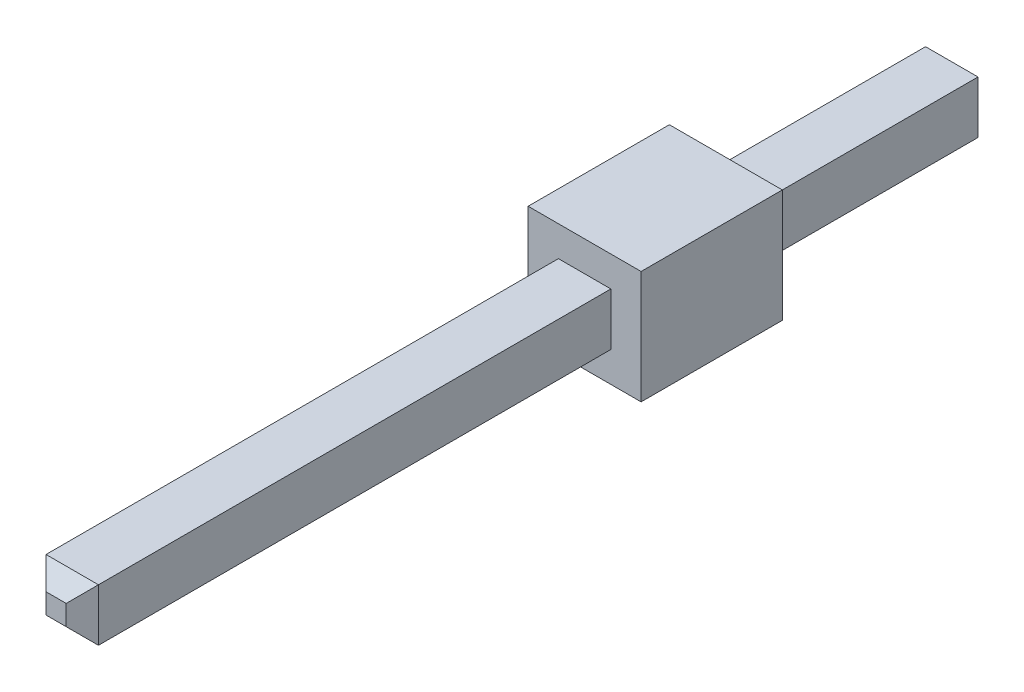
ISO-10303-21;
HEADER;
FILE_DESCRIPTION(('STEP AP214'),'2;1');
FILE_NAME('part.step','',(''),(''),'','','');
FILE_SCHEMA(('AUTOMOTIVE_DESIGN { 1 0 10303 214 1 1 1 1 }'));
ENDSEC;
DATA;
#1=APPLICATION_CONTEXT('core data for automotive mechanical design processes');
#2=APPLICATION_PROTOCOL_DEFINITION('international standard','automotive_design',2000,#1);
#3=PRODUCT_CONTEXT('',#1,'mechanical');
#4=PRODUCT('Part','Part','',(#3));
#5=PRODUCT_RELATED_PRODUCT_CATEGORY('part','',(#4));
#6=PRODUCT_DEFINITION_FORMATION('','',#4);
#7=PRODUCT_DEFINITION_CONTEXT('part definition',#1,'design');
#8=PRODUCT_DEFINITION('design','',#6,#7);
#9=PRODUCT_DEFINITION_SHAPE('','',#8);
#10=(LENGTH_UNIT() NAMED_UNIT(*) SI_UNIT(.MILLI.,.METRE.));
#11=(NAMED_UNIT(*) PLANE_ANGLE_UNIT() SI_UNIT($,.RADIAN.));
#12=(NAMED_UNIT(*) SI_UNIT($,.STERADIAN.) SOLID_ANGLE_UNIT());
#13=UNCERTAINTY_MEASURE_WITH_UNIT(LENGTH_MEASURE(1.E-05),#10,'distance_accuracy_value','');
#14=(GEOMETRIC_REPRESENTATION_CONTEXT(3) GLOBAL_UNCERTAINTY_ASSIGNED_CONTEXT((#13)) GLOBAL_UNIT_ASSIGNED_CONTEXT((#10,
#11,#12)) REPRESENTATION_CONTEXT('',''));
#15=CARTESIAN_POINT('',(0.,0.,0.));
#16=DIRECTION('',(0.,0.,1.));
#17=DIRECTION('',(1.,0.,0.));
#18=AXIS2_PLACEMENT_3D('',#15,#16,#17);
#19=CARTESIAN_POINT('',(-4.755,-4.110559370205,9.));
#20=DIRECTION('',(1.,0.,0.));
#21=DIRECTION('',(0.,1.,0.));
#22=AXIS2_PLACEMENT_3D('',#19,#20,#21);
#23=PLANE('',#22);
#24=DIRECTION('',(0.,0.,-1.));
#25=VECTOR('',#24,1.);
#26=CARTESIAN_POINT('',(-4.755,-3.785559370205,9.));
#27=LINE('',#26,#25);
#28=CARTESIAN_POINT('',(-4.755,-3.785559370205,8.8));
#29=VERTEX_POINT('',#28);
#30=CARTESIAN_POINT('',(-4.755,-3.785559370205,2.45));
#31=VERTEX_POINT('',#30);
#32=EDGE_CURVE('E11',#29,#31,#27,.T.);
#33=ORIENTED_EDGE('',*,*,#32,.F.);
#34=DIRECTION('',(0.,-1.,0.));
#35=VECTOR('',#34,1.);
#36=CARTESIAN_POINT('',(-4.755,-4.110559370205,8.8));
#37=LINE('',#36,#35);
#38=CARTESIAN_POINT('',(-4.755,-4.435559370205,8.8));
#39=VERTEX_POINT('',#38);
#40=EDGE_CURVE('E211',#29,#39,#37,.T.);
#41=ORIENTED_EDGE('',*,*,#40,.T.);
#42=DIRECTION('',(0.,0.,-1.));
#43=VECTOR('',#42,1.);
#44=CARTESIAN_POINT('',(-4.755,-4.435559370205,9.));
#45=LINE('',#44,#43);
#46=CARTESIAN_POINT('',(-4.755,-4.435559370205,2.45));
#47=VERTEX_POINT('',#46);
#48=EDGE_CURVE('E47',#39,#47,#45,.T.);
#49=ORIENTED_EDGE('',*,*,#48,.T.);
#50=DIRECTION('',(0.,-1.,0.));
#51=VECTOR('',#50,1.);
#52=CARTESIAN_POINT('',(-4.755,-4.110559370205,2.45));
#53=LINE('',#52,#51);
#54=EDGE_CURVE('E350',#31,#47,#53,.T.);
#55=ORIENTED_EDGE('',*,*,#54,.F.);
#56=EDGE_LOOP('',(#33,#41,#49,#55));
#57=FACE_BOUND('',#56,.T.);
#58=ADVANCED_FACE('F17',(#57),#23,.T.);
#59=CARTESIAN_POINT('',(-5.08,-3.785559370205,9.));
#60=DIRECTION('',(0.,-1.,0.));
#61=DIRECTION('',(0.,0.,-1.));
#62=AXIS2_PLACEMENT_3D('',#59,#60,#61);
#63=PLANE('',#62);
#64=DIRECTION('',(0.,0.,-1.));
#65=VECTOR('',#64,1.);
#66=CARTESIAN_POINT('',(-5.405,-3.785559370205,9.));
#67=LINE('',#66,#65);
#68=CARTESIAN_POINT('',(-5.405,-3.785559370205,8.8));
#69=VERTEX_POINT('',#68);
#70=CARTESIAN_POINT('',(-5.405,-3.785559370205,2.45));
#71=VERTEX_POINT('',#70);
#72=EDGE_CURVE('E25',#69,#71,#67,.T.);
#73=ORIENTED_EDGE('',*,*,#72,.F.);
#74=DIRECTION('',(1.,0.,0.));
#75=VECTOR('',#74,1.);
#76=CARTESIAN_POINT('',(-4.755,-3.785559370205,8.8));
#77=LINE('',#76,#75);
#78=EDGE_CURVE('E170',#69,#29,#77,.T.);
#79=ORIENTED_EDGE('',*,*,#78,.T.);
#80=ORIENTED_EDGE('',*,*,#32,.T.);
#81=DIRECTION('',(-1.,0.,0.));
#82=VECTOR('',#81,1.);
#83=CARTESIAN_POINT('',(-5.08,-3.785559370205,2.45));
#84=LINE('',#83,#82);
#85=EDGE_CURVE('E173',#31,#71,#84,.T.);
#86=ORIENTED_EDGE('',*,*,#85,.T.);
#87=EDGE_LOOP('',(#73,#79,#80,#86));
#88=FACE_BOUND('',#87,.T.);
#89=ADVANCED_FACE('F169',(#88),#63,.F.);
#90=CARTESIAN_POINT('',(-5.405,-4.110559370205,9.));
#91=DIRECTION('',(1.,0.,0.));
#92=DIRECTION('',(0.,1.,0.));
#93=AXIS2_PLACEMENT_3D('',#90,#91,#92);
#94=PLANE('',#93);
#95=DIRECTION('',(0.,0.,-1.));
#96=VECTOR('',#95,1.);
#97=CARTESIAN_POINT('',(-5.405,-4.435559370205,9.));
#98=LINE('',#97,#96);
#99=CARTESIAN_POINT('',(-5.405,-4.435559370205,8.8));
#100=VERTEX_POINT('',#99);
#101=CARTESIAN_POINT('',(-5.405,-4.435559370205,2.45));
#102=VERTEX_POINT('',#101);
#103=EDGE_CURVE('E37',#100,#102,#98,.T.);
#104=ORIENTED_EDGE('',*,*,#103,.F.);
#105=DIRECTION('',(0.,1.,0.));
#106=VECTOR('',#105,1.);
#107=CARTESIAN_POINT('',(-5.405,-3.785559370205,8.8));
#108=LINE('',#107,#106);
#109=EDGE_CURVE('E191',#100,#69,#108,.T.);
#110=ORIENTED_EDGE('',*,*,#109,.T.);
#111=ORIENTED_EDGE('',*,*,#72,.T.);
#112=DIRECTION('',(0.,-1.,0.));
#113=VECTOR('',#112,1.);
#114=CARTESIAN_POINT('',(-5.405,-4.110559370205,2.45));
#115=LINE('',#114,#113);
#116=EDGE_CURVE('E259',#71,#102,#115,.T.);
#117=ORIENTED_EDGE('',*,*,#116,.T.);
#118=EDGE_LOOP('',(#104,#110,#111,#117));
#119=FACE_BOUND('',#118,.T.);
#120=ADVANCED_FACE('F192',(#119),#94,.F.);
#121=CARTESIAN_POINT('',(-5.08,-4.435559370205,9.));
#122=DIRECTION('',(0.,-1.,0.));
#123=DIRECTION('',(0.,0.,-1.));
#124=AXIS2_PLACEMENT_3D('',#121,#122,#123);
#125=PLANE('',#124);
#126=ORIENTED_EDGE('',*,*,#48,.F.);
#127=DIRECTION('',(-1.,0.,0.));
#128=VECTOR('',#127,1.);
#129=CARTESIAN_POINT('',(-5.08,-4.435559370205,8.8));
#130=LINE('',#129,#128);
#131=EDGE_CURVE('E238',#39,#100,#130,.T.);
#132=ORIENTED_EDGE('',*,*,#131,.T.);
#133=ORIENTED_EDGE('',*,*,#103,.T.);
#134=DIRECTION('',(-1.,0.,0.));
#135=VECTOR('',#134,1.);
#136=CARTESIAN_POINT('',(-5.08,-4.435559370205,2.45));
#137=LINE('',#136,#135);
#138=EDGE_CURVE('E354',#47,#102,#137,.T.);
#139=ORIENTED_EDGE('',*,*,#138,.F.);
#140=EDGE_LOOP('',(#126,#132,#133,#139));
#141=FACE_BOUND('',#140,.T.);
#142=ADVANCED_FACE('F415',(#141),#125,.T.);
#143=CARTESIAN_POINT('',(-5.08,-4.110559370205,9.));
#144=DIRECTION('',(0.,0.,1.));
#145=DIRECTION('',(1.,0.,0.));
#146=AXIS2_PLACEMENT_3D('',#143,#144,#145);
#147=PLANE('',#146);
#148=DIRECTION('',(0.,-1.,0.));
#149=VECTOR('',#148,1.);
#150=CARTESIAN_POINT('',(-5.205,-4.435559370205,9.));
#151=LINE('',#150,#149);
#152=CARTESIAN_POINT('',(-5.205,-3.985559370205,9.));
#153=VERTEX_POINT('',#152);
#154=CARTESIAN_POINT('',(-5.205,-4.235559370205,9.));
#155=VERTEX_POINT('',#154);
#156=EDGE_CURVE('E201',#153,#155,#151,.T.);
#157=ORIENTED_EDGE('',*,*,#156,.T.);
#158=DIRECTION('',(1.,0.,0.));
#159=VECTOR('',#158,1.);
#160=CARTESIAN_POINT('',(-5.08,-4.235559370205,9.));
#161=LINE('',#160,#159);
#162=CARTESIAN_POINT('',(-4.955,-4.235559370205,9.));
#163=VERTEX_POINT('',#162);
#164=EDGE_CURVE('E223',#155,#163,#161,.T.);
#165=ORIENTED_EDGE('',*,*,#164,.T.);
#166=DIRECTION('',(0.,1.,0.));
#167=VECTOR('',#166,1.);
#168=CARTESIAN_POINT('',(-4.955,-4.110559370205,9.));
#169=LINE('',#168,#167);
#170=CARTESIAN_POINT('',(-4.955,-3.985559370205,9.));
#171=VERTEX_POINT('',#170);
#172=EDGE_CURVE('E208',#163,#171,#169,.T.);
#173=ORIENTED_EDGE('',*,*,#172,.T.);
#174=DIRECTION('',(-1.,0.,0.));
#175=VECTOR('',#174,1.);
#176=CARTESIAN_POINT('',(-5.405,-3.985559370205,9.));
#177=LINE('',#176,#175);
#178=EDGE_CURVE('E188',#171,#153,#177,.T.);
#179=ORIENTED_EDGE('',*,*,#178,.T.);
#180=EDGE_LOOP('',(#157,#165,#173,#179));
#181=FACE_BOUND('',#180,.T.);
#182=ADVANCED_FACE('F417',(#181),#147,.T.);
#183=CARTESIAN_POINT('',(-5.08,-4.810559370205,2.45));
#184=DIRECTION('',(0.,-1.,0.));
#185=DIRECTION('',(0.,0.,-1.));
#186=AXIS2_PLACEMENT_3D('',#183,#184,#185);
#187=PLANE('',#186);
#188=DIRECTION('',(-1.,0.,0.));
#189=VECTOR('',#188,1.);
#190=CARTESIAN_POINT('',(-5.08,-4.810559370205,0.7));
#191=LINE('',#190,#189);
#192=CARTESIAN_POINT('',(-4.38,-4.810559370205,0.7));
#193=VERTEX_POINT('',#192);
#194=CARTESIAN_POINT('',(-5.78,-4.810559370205,0.7));
#195=VERTEX_POINT('',#194);
#196=EDGE_CURVE('E333',#193,#195,#191,.T.);
#197=ORIENTED_EDGE('',*,*,#196,.F.);
#198=DIRECTION('',(0.,0.,-1.));
#199=VECTOR('',#198,1.);
#200=CARTESIAN_POINT('',(-4.38,-4.810559370205,2.45));
#201=LINE('',#200,#199);
#202=CARTESIAN_POINT('',(-4.38,-4.810559370205,2.45));
#203=VERTEX_POINT('',#202);
#204=EDGE_CURVE('E231',#203,#193,#201,.T.);
#205=ORIENTED_EDGE('',*,*,#204,.F.);
#206=DIRECTION('',(-1.,0.,0.));
#207=VECTOR('',#206,1.);
#208=CARTESIAN_POINT('',(-5.08,-4.810559370205,2.45));
#209=LINE('',#208,#207);
#210=CARTESIAN_POINT('',(-5.78,-4.810559370205,2.45));
#211=VERTEX_POINT('',#210);
#212=EDGE_CURVE('E319',#203,#211,#209,.T.);
#213=ORIENTED_EDGE('',*,*,#212,.T.);
#214=DIRECTION('',(0.,0.,-1.));
#215=VECTOR('',#214,1.);
#216=CARTESIAN_POINT('',(-5.78,-4.810559370205,2.45));
#217=LINE('',#216,#215);
#218=EDGE_CURVE('E255',#211,#195,#217,.T.);
#219=ORIENTED_EDGE('',*,*,#218,.T.);
#220=EDGE_LOOP('',(#197,#205,#213,#219));
#221=FACE_BOUND('',#220,.T.);
#222=ADVANCED_FACE('F377',(#221),#187,.T.);
#223=CARTESIAN_POINT('',(-4.38,-4.110559370205,2.45));
#224=DIRECTION('',(-1.,0.,0.));
#225=DIRECTION('',(0.,1.,0.));
#226=AXIS2_PLACEMENT_3D('',#223,#224,#225);
#227=PLANE('',#226);
#228=DIRECTION('',(0.,1.,0.));
#229=VECTOR('',#228,1.);
#230=CARTESIAN_POINT('',(-4.38,-4.110559370205,0.7));
#231=LINE('',#230,#229);
#232=CARTESIAN_POINT('',(-4.38,-3.410559370205,0.7));
#233=VERTEX_POINT('',#232);
#234=EDGE_CURVE('E295',#193,#233,#231,.T.);
#235=ORIENTED_EDGE('',*,*,#234,.T.);
#236=DIRECTION('',(0.,0.,-1.));
#237=VECTOR('',#236,1.);
#238=CARTESIAN_POINT('',(-4.38,-3.410559370205,2.45));
#239=LINE('',#238,#237);
#240=CARTESIAN_POINT('',(-4.38,-3.410559370205,2.45));
#241=VERTEX_POINT('',#240);
#242=EDGE_CURVE('E362',#241,#233,#239,.T.);
#243=ORIENTED_EDGE('',*,*,#242,.F.);
#244=DIRECTION('',(0.,1.,0.));
#245=VECTOR('',#244,1.);
#246=CARTESIAN_POINT('',(-4.38,-4.110559370205,2.45));
#247=LINE('',#246,#245);
#248=EDGE_CURVE('E290',#203,#241,#247,.T.);
#249=ORIENTED_EDGE('',*,*,#248,.F.);
#250=ORIENTED_EDGE('',*,*,#204,.T.);
#251=EDGE_LOOP('',(#235,#243,#249,#250));
#252=FACE_BOUND('',#251,.T.);
#253=ADVANCED_FACE('F370',(#252),#227,.F.);
#254=CARTESIAN_POINT('',(-5.08,-3.410559370205,2.45));
#255=DIRECTION('',(0.,-1.,0.));
#256=DIRECTION('',(0.,0.,-1.));
#257=AXIS2_PLACEMENT_3D('',#254,#255,#256);
#258=PLANE('',#257);
#259=DIRECTION('',(-1.,0.,0.));
#260=VECTOR('',#259,1.);
#261=CARTESIAN_POINT('',(-5.08,-3.410559370205,0.7));
#262=LINE('',#261,#260);
#263=CARTESIAN_POINT('',(-5.78,-3.410559370205,0.7));
#264=VERTEX_POINT('',#263);
#265=EDGE_CURVE('E291',#233,#264,#262,.T.);
#266=ORIENTED_EDGE('',*,*,#265,.T.);
#267=DIRECTION('',(0.,0.,-1.));
#268=VECTOR('',#267,1.);
#269=CARTESIAN_POINT('',(-5.78,-3.410559370205,2.45));
#270=LINE('',#269,#268);
#271=CARTESIAN_POINT('',(-5.78,-3.410559370205,2.45));
#272=VERTEX_POINT('',#271);
#273=EDGE_CURVE('E258',#272,#264,#270,.T.);
#274=ORIENTED_EDGE('',*,*,#273,.F.);
#275=DIRECTION('',(-1.,0.,0.));
#276=VECTOR('',#275,1.);
#277=CARTESIAN_POINT('',(-5.08,-3.410559370205,2.45));
#278=LINE('',#277,#276);
#279=EDGE_CURVE('E282',#241,#272,#278,.T.);
#280=ORIENTED_EDGE('',*,*,#279,.F.);
#281=ORIENTED_EDGE('',*,*,#242,.T.);
#282=EDGE_LOOP('',(#266,#274,#280,#281));
#283=FACE_BOUND('',#282,.T.);
#284=ADVANCED_FACE('F384',(#283),#258,.F.);
#285=CARTESIAN_POINT('',(-5.78,-4.110559370205,2.45));
#286=DIRECTION('',(-1.,0.,0.));
#287=DIRECTION('',(0.,1.,0.));
#288=AXIS2_PLACEMENT_3D('',#285,#286,#287);
#289=PLANE('',#288);
#290=DIRECTION('',(0.,1.,0.));
#291=VECTOR('',#290,1.);
#292=CARTESIAN_POINT('',(-5.78,-4.110559370205,0.7));
#293=LINE('',#292,#291);
#294=EDGE_CURVE('E296',#195,#264,#293,.T.);
#295=ORIENTED_EDGE('',*,*,#294,.F.);
#296=ORIENTED_EDGE('',*,*,#218,.F.);
#297=DIRECTION('',(0.,1.,0.));
#298=VECTOR('',#297,1.);
#299=CARTESIAN_POINT('',(-5.78,-4.110559370205,2.45));
#300=LINE('',#299,#298);
#301=EDGE_CURVE('E278',#211,#272,#300,.T.);
#302=ORIENTED_EDGE('',*,*,#301,.T.);
#303=ORIENTED_EDGE('',*,*,#273,.T.);
#304=EDGE_LOOP('',(#295,#296,#302,#303));
#305=FACE_BOUND('',#304,.T.);
#306=ADVANCED_FACE('F381',(#305),#289,.T.);
#307=CARTESIAN_POINT('',(-5.08,-4.110559370205,2.45));
#308=DIRECTION('',(0.,0.,1.));
#309=DIRECTION('',(1.,0.,0.));
#310=AXIS2_PLACEMENT_3D('',#307,#308,#309);
#311=PLANE('',#310);
#312=ORIENTED_EDGE('',*,*,#85,.F.);
#313=ORIENTED_EDGE('',*,*,#54,.T.);
#314=ORIENTED_EDGE('',*,*,#138,.T.);
#315=ORIENTED_EDGE('',*,*,#116,.F.);
#316=EDGE_LOOP('',(#312,#313,#314,#315));
#317=FACE_BOUND('',#316,.T.);
#318=ORIENTED_EDGE('',*,*,#212,.F.);
#319=ORIENTED_EDGE('',*,*,#248,.T.);
#320=ORIENTED_EDGE('',*,*,#279,.T.);
#321=ORIENTED_EDGE('',*,*,#301,.F.);
#322=EDGE_LOOP('',(#318,#319,#320,#321));
#323=FACE_BOUND('',#322,.T.);
#324=ADVANCED_FACE('F386',(#317,#323),#311,.T.);
#325=CARTESIAN_POINT('',(-5.08,-4.110559370205,0.7));
#326=DIRECTION('',(0.,0.,1.));
#327=DIRECTION('',(1.,0.,0.));
#328=AXIS2_PLACEMENT_3D('',#325,#326,#327);
#329=PLANE('',#328);
#330=DIRECTION('',(0.,-1.,0.));
#331=VECTOR('',#330,1.);
#332=CARTESIAN_POINT('',(-4.755,-4.110559370205,0.7));
#333=LINE('',#332,#331);
#334=CARTESIAN_POINT('',(-4.755,-3.785559370205,0.7));
#335=VERTEX_POINT('',#334);
#336=CARTESIAN_POINT('',(-4.755,-4.435559370205,0.7));
#337=VERTEX_POINT('',#336);
#338=EDGE_CURVE('E263',#335,#337,#333,.T.);
#339=ORIENTED_EDGE('',*,*,#338,.F.);
#340=DIRECTION('',(-1.,0.,0.));
#341=VECTOR('',#340,1.);
#342=CARTESIAN_POINT('',(-5.08,-3.785559370205,0.7));
#343=LINE('',#342,#341);
#344=CARTESIAN_POINT('',(-5.405,-3.785559370205,0.7));
#345=VERTEX_POINT('',#344);
#346=EDGE_CURVE('E315',#335,#345,#343,.T.);
#347=ORIENTED_EDGE('',*,*,#346,.T.);
#348=DIRECTION('',(0.,-1.,0.));
#349=VECTOR('',#348,1.);
#350=CARTESIAN_POINT('',(-5.405,-4.110559370205,0.7));
#351=LINE('',#350,#349);
#352=CARTESIAN_POINT('',(-5.405,-4.435559370205,0.7));
#353=VERTEX_POINT('',#352);
#354=EDGE_CURVE('E326',#345,#353,#351,.T.);
#355=ORIENTED_EDGE('',*,*,#354,.T.);
#356=DIRECTION('',(-1.,0.,0.));
#357=VECTOR('',#356,1.);
#358=CARTESIAN_POINT('',(-5.08,-4.435559370205,0.7));
#359=LINE('',#358,#357);
#360=EDGE_CURVE('E330',#337,#353,#359,.T.);
#361=ORIENTED_EDGE('',*,*,#360,.F.);
#362=EDGE_LOOP('',(#339,#347,#355,#361));
#363=FACE_BOUND('',#362,.T.);
#364=ORIENTED_EDGE('',*,*,#196,.T.);
#365=ORIENTED_EDGE('',*,*,#294,.T.);
#366=ORIENTED_EDGE('',*,*,#265,.F.);
#367=ORIENTED_EDGE('',*,*,#234,.F.);
#368=EDGE_LOOP('',(#364,#365,#366,#367));
#369=FACE_BOUND('',#368,.T.);
#370=ADVANCED_FACE('F376',(#363,#369),#329,.F.);
#371=CARTESIAN_POINT('',(-5.08,-4.110559370205,-2.3));
#372=DIRECTION('',(0.,0.,1.));
#373=DIRECTION('',(1.,0.,0.));
#374=AXIS2_PLACEMENT_3D('',#371,#372,#373);
#375=PLANE('',#374);
#376=DIRECTION('',(0.,-1.,0.));
#377=VECTOR('',#376,1.);
#378=CARTESIAN_POINT('',(-4.955,-4.435559370205,-2.3));
#379=LINE('',#378,#377);
#380=CARTESIAN_POINT('',(-4.955,-3.985559370205,-2.3));
#381=VERTEX_POINT('',#380);
#382=CARTESIAN_POINT('',(-4.955,-4.235559370205,-2.3));
#383=VERTEX_POINT('',#382);
#384=EDGE_CURVE('E300',#381,#383,#379,.T.);
#385=ORIENTED_EDGE('',*,*,#384,.T.);
#386=DIRECTION('',(-1.,0.,0.));
#387=VECTOR('',#386,1.);
#388=CARTESIAN_POINT('',(-5.405,-4.235559370205,-2.3));
#389=LINE('',#388,#387);
#390=CARTESIAN_POINT('',(-5.205,-4.235559370205,-2.3));
#391=VERTEX_POINT('',#390);
#392=EDGE_CURVE('E244',#383,#391,#389,.T.);
#393=ORIENTED_EDGE('',*,*,#392,.T.);
#394=DIRECTION('',(0.,1.,0.));
#395=VECTOR('',#394,1.);
#396=CARTESIAN_POINT('',(-5.205,-4.110559370205,-2.3));
#397=LINE('',#396,#395);
#398=CARTESIAN_POINT('',(-5.205,-3.985559370205,-2.3));
#399=VERTEX_POINT('',#398);
#400=EDGE_CURVE('E224',#391,#399,#397,.T.);
#401=ORIENTED_EDGE('',*,*,#400,.T.);
#402=DIRECTION('',(1.,0.,0.));
#403=VECTOR('',#402,1.);
#404=CARTESIAN_POINT('',(-5.08,-3.985559370205,-2.3));
#405=LINE('',#404,#403);
#406=EDGE_CURVE('E243',#399,#381,#405,.T.);
#407=ORIENTED_EDGE('',*,*,#406,.T.);
#408=EDGE_LOOP('',(#385,#393,#401,#407));
#409=FACE_BOUND('',#408,.T.);
#410=ADVANCED_FACE('F396',(#409),#375,.F.);
#411=CARTESIAN_POINT('',(-5.08,-4.435559370205,9.));
#412=DIRECTION('',(0.,-1.,0.));
#413=DIRECTION('',(0.,0.,-1.));
#414=AXIS2_PLACEMENT_3D('',#411,#412,#413);
#415=PLANE('',#414);
#416=DIRECTION('',(0.,0.,-1.));
#417=VECTOR('',#416,1.);
#418=CARTESIAN_POINT('',(-5.405,-4.435559370205,9.));
#419=LINE('',#418,#417);
#420=CARTESIAN_POINT('',(-5.405,-4.435559370205,-2.1));
#421=VERTEX_POINT('',#420);
#422=EDGE_CURVE('E323',#353,#421,#419,.T.);
#423=ORIENTED_EDGE('',*,*,#422,.T.);
#424=DIRECTION('',(1.,0.,0.));
#425=VECTOR('',#424,1.);
#426=CARTESIAN_POINT('',(-4.755,-4.435559370205,-2.1));
#427=LINE('',#426,#425);
#428=CARTESIAN_POINT('',(-4.755,-4.435559370205,-2.1));
#429=VERTEX_POINT('',#428);
#430=EDGE_CURVE('E272',#421,#429,#427,.T.);
#431=ORIENTED_EDGE('',*,*,#430,.T.);
#432=DIRECTION('',(0.,0.,-1.));
#433=VECTOR('',#432,1.);
#434=CARTESIAN_POINT('',(-4.755,-4.435559370205,9.));
#435=LINE('',#434,#433);
#436=EDGE_CURVE('E264',#337,#429,#435,.T.);
#437=ORIENTED_EDGE('',*,*,#436,.F.);
#438=ORIENTED_EDGE('',*,*,#360,.T.);
#439=EDGE_LOOP('',(#423,#431,#437,#438));
#440=FACE_BOUND('',#439,.T.);
#441=ADVANCED_FACE('F511',(#440),#415,.T.);
#442=CARTESIAN_POINT('',(-5.405,-4.110559370205,9.));
#443=DIRECTION('',(1.,0.,0.));
#444=DIRECTION('',(0.,1.,0.));
#445=AXIS2_PLACEMENT_3D('',#442,#443,#444);
#446=PLANE('',#445);
#447=DIRECTION('',(0.,0.,-1.));
#448=VECTOR('',#447,1.);
#449=CARTESIAN_POINT('',(-5.405,-3.785559370205,9.));
#450=LINE('',#449,#448);
#451=CARTESIAN_POINT('',(-5.405,-3.785559370205,-2.1));
#452=VERTEX_POINT('',#451);
#453=EDGE_CURVE('E312',#345,#452,#450,.T.);
#454=ORIENTED_EDGE('',*,*,#453,.T.);
#455=DIRECTION('',(0.,-1.,0.));
#456=VECTOR('',#455,1.);
#457=CARTESIAN_POINT('',(-5.405,-4.110559370205,-2.1));
#458=LINE('',#457,#456);
#459=EDGE_CURVE('E254',#452,#421,#458,.T.);
#460=ORIENTED_EDGE('',*,*,#459,.T.);
#461=ORIENTED_EDGE('',*,*,#422,.F.);
#462=ORIENTED_EDGE('',*,*,#354,.F.);
#463=EDGE_LOOP('',(#454,#460,#461,#462));
#464=FACE_BOUND('',#463,.T.);
#465=ADVANCED_FACE('F515',(#464),#446,.F.);
#466=CARTESIAN_POINT('',(-5.08,-3.785559370205,9.));
#467=DIRECTION('',(0.,-1.,0.));
#468=DIRECTION('',(0.,0.,-1.));
#469=AXIS2_PLACEMENT_3D('',#466,#467,#468);
#470=PLANE('',#469);
#471=DIRECTION('',(0.,0.,-1.));
#472=VECTOR('',#471,1.);
#473=CARTESIAN_POINT('',(-4.755,-3.785559370205,9.));
#474=LINE('',#473,#472);
#475=CARTESIAN_POINT('',(-4.755,-3.785559370205,-2.1));
#476=VERTEX_POINT('',#475);
#477=EDGE_CURVE('E260',#335,#476,#474,.T.);
#478=ORIENTED_EDGE('',*,*,#477,.T.);
#479=DIRECTION('',(-1.,0.,0.));
#480=VECTOR('',#479,1.);
#481=CARTESIAN_POINT('',(-5.08,-3.785559370205,-2.1));
#482=LINE('',#481,#480);
#483=EDGE_CURVE('E286',#476,#452,#482,.T.);
#484=ORIENTED_EDGE('',*,*,#483,.T.);
#485=ORIENTED_EDGE('',*,*,#453,.F.);
#486=ORIENTED_EDGE('',*,*,#346,.F.);
#487=EDGE_LOOP('',(#478,#484,#485,#486));
#488=FACE_BOUND('',#487,.T.);
#489=ADVANCED_FACE('F519',(#488),#470,.F.);
#490=CARTESIAN_POINT('',(-4.755,-4.110559370205,9.));
#491=DIRECTION('',(1.,0.,0.));
#492=DIRECTION('',(0.,1.,0.));
#493=AXIS2_PLACEMENT_3D('',#490,#491,#492);
#494=PLANE('',#493);
#495=ORIENTED_EDGE('',*,*,#436,.T.);
#496=DIRECTION('',(0.,1.,0.));
#497=VECTOR('',#496,1.);
#498=CARTESIAN_POINT('',(-4.755,-3.785559370205,-2.1));
#499=LINE('',#498,#497);
#500=EDGE_CURVE('E303',#429,#476,#499,.T.);
#501=ORIENTED_EDGE('',*,*,#500,.T.);
#502=ORIENTED_EDGE('',*,*,#477,.F.);
#503=ORIENTED_EDGE('',*,*,#338,.T.);
#504=EDGE_LOOP('',(#495,#501,#502,#503));
#505=FACE_BOUND('',#504,.T.);
#506=ADVANCED_FACE('F532',(#505),#494,.T.);
#507=CARTESIAN_POINT('',(-4.955,-4.110559370205,-2.3));
#508=DIRECTION('',(0.707106781186548,0.,-0.707106781186548));
#509=DIRECTION('',(0.,-1.,0.));
#510=AXIS2_PLACEMENT_3D('',#507,#508,#509);
#511=PLANE('',#510);
#512=DIRECTION('',(0.577350269189626,-0.577350269189626,0.577350269189626));
#513=VECTOR('',#512,1.);
#514=CARTESIAN_POINT('',(-4.996666666667,-4.193892703539,-2.341666666667));
#515=LINE('',#514,#513);
#516=EDGE_CURVE('E268',#383,#429,#515,.T.);
#517=ORIENTED_EDGE('',*,*,#516,.F.);
#518=ORIENTED_EDGE('',*,*,#384,.F.);
#519=DIRECTION('',(0.577350269189626,0.577350269189626,0.577350269189626));
#520=VECTOR('',#519,1.);
#521=CARTESIAN_POINT('',(-4.863333333333,-3.893892703539,-2.208333333333));
#522=LINE('',#521,#520);
#523=EDGE_CURVE('E239',#381,#476,#522,.T.);
#524=ORIENTED_EDGE('',*,*,#523,.T.);
#525=ORIENTED_EDGE('',*,*,#500,.F.);
#526=EDGE_LOOP('',(#517,#518,#524,#525));
#527=FACE_BOUND('',#526,.T.);
#528=ADVANCED_FACE('F546',(#527),#511,.T.);
#529=CARTESIAN_POINT('',(-5.08,-3.785559370205,-2.1));
#530=DIRECTION('',(0.,-0.707106781186548,0.707106781186548));
#531=DIRECTION('',(-1.,0.,0.));
#532=AXIS2_PLACEMENT_3D('',#529,#530,#531);
#533=PLANE('',#532);
#534=ORIENTED_EDGE('',*,*,#523,.F.);
#535=ORIENTED_EDGE('',*,*,#406,.F.);
#536=DIRECTION('',(-0.577350269189626,0.577350269189626,0.577350269189626));
#537=VECTOR('',#536,1.);
#538=CARTESIAN_POINT('',(-5.296666666667,-3.893892703539,-2.208333333333));
#539=LINE('',#538,#537);
#540=EDGE_CURVE('E210',#399,#452,#539,.T.);
#541=ORIENTED_EDGE('',*,*,#540,.T.);
#542=ORIENTED_EDGE('',*,*,#483,.F.);
#543=EDGE_LOOP('',(#534,#535,#541,#542));
#544=FACE_BOUND('',#543,.T.);
#545=ADVANCED_FACE('F540',(#544),#533,.F.);
#546=CARTESIAN_POINT('',(-5.08,-4.235559370205,-2.3));
#547=DIRECTION('',(0.,-0.707106781186548,-0.707106781186548));
#548=DIRECTION('',(0.,-0.707106781186548,0.707106781186548));
#549=AXIS2_PLACEMENT_3D('',#546,#547,#548);
#550=PLANE('',#549);
#551=ORIENTED_EDGE('',*,*,#516,.T.);
#552=ORIENTED_EDGE('',*,*,#430,.F.);
#553=DIRECTION('',(-0.577350269189626,-0.577350269189626,0.577350269189626));
#554=VECTOR('',#553,1.);
#555=CARTESIAN_POINT('',(-5.163333333333,-4.193892703539,-2.341666666667));
#556=LINE('',#555,#554);
#557=EDGE_CURVE('E228',#391,#421,#556,.T.);
#558=ORIENTED_EDGE('',*,*,#557,.F.);
#559=ORIENTED_EDGE('',*,*,#392,.F.);
#560=EDGE_LOOP('',(#551,#552,#558,#559));
#561=FACE_BOUND('',#560,.T.);
#562=ADVANCED_FACE('F545',(#561),#550,.T.);
#563=CARTESIAN_POINT('',(-5.405,-4.110559370205,-2.1));
#564=DIRECTION('',(0.707106781186548,0.,0.707106781186548));
#565=DIRECTION('',(0.,-1.,0.));
#566=AXIS2_PLACEMENT_3D('',#563,#564,#565);
#567=PLANE('',#566);
#568=ORIENTED_EDGE('',*,*,#540,.F.);
#569=ORIENTED_EDGE('',*,*,#400,.F.);
#570=ORIENTED_EDGE('',*,*,#557,.T.);
#571=ORIENTED_EDGE('',*,*,#459,.F.);
#572=EDGE_LOOP('',(#568,#569,#570,#571));
#573=FACE_BOUND('',#572,.T.);
#574=ADVANCED_FACE('F567',(#573),#567,.F.);
#575=CARTESIAN_POINT('',(-4.755,-4.110559370205,8.8));
#576=DIRECTION('',(-0.707106781186548,0.,-0.707106781186548));
#577=DIRECTION('',(-0.707106781186548,0.,0.707106781186548));
#578=AXIS2_PLACEMENT_3D('',#575,#576,#577);
#579=PLANE('',#578);
#580=DIRECTION('',(-0.577350269189626,0.577350269189626,0.577350269189626));
#581=VECTOR('',#580,1.);
#582=CARTESIAN_POINT('',(-4.863333333333,-4.327226036872,8.908333333333));
#583=LINE('',#582,#581);
#584=EDGE_CURVE('E219',#39,#163,#583,.T.);
#585=ORIENTED_EDGE('',*,*,#584,.F.);
#586=ORIENTED_EDGE('',*,*,#40,.F.);
#587=DIRECTION('',(-0.577350269189626,-0.577350269189626,0.577350269189626));
#588=VECTOR('',#587,1.);
#589=CARTESIAN_POINT('',(-4.996666666667,-4.027226036872,9.041666666667));
#590=LINE('',#589,#588);
#591=EDGE_CURVE('E186',#29,#171,#590,.T.);
#592=ORIENTED_EDGE('',*,*,#591,.T.);
#593=ORIENTED_EDGE('',*,*,#172,.F.);
#594=EDGE_LOOP('',(#585,#586,#592,#593));
#595=FACE_BOUND('',#594,.T.);
#596=ADVANCED_FACE('F411',(#595),#579,.F.);
#597=CARTESIAN_POINT('',(-5.08,-3.985559370205,9.));
#598=DIRECTION('',(0.,0.707106781186548,0.707106781186548));
#599=DIRECTION('',(1.,0.,0.));
#600=AXIS2_PLACEMENT_3D('',#597,#598,#599);
#601=PLANE('',#600);
#602=ORIENTED_EDGE('',*,*,#591,.F.);
#603=ORIENTED_EDGE('',*,*,#78,.F.);
#604=DIRECTION('',(0.577350269189626,-0.577350269189626,0.577350269189626));
#605=VECTOR('',#604,1.);
#606=CARTESIAN_POINT('',(-5.163333333333,-4.027226036872,9.041666666667));
#607=LINE('',#606,#605);
#608=EDGE_CURVE('E184',#69,#153,#607,.T.);
#609=ORIENTED_EDGE('',*,*,#608,.T.);
#610=ORIENTED_EDGE('',*,*,#178,.F.);
#611=EDGE_LOOP('',(#602,#603,#609,#610));
#612=FACE_BOUND('',#611,.T.);
#613=ADVANCED_FACE('F181',(#612),#601,.T.);
#614=CARTESIAN_POINT('',(-5.08,-4.435559370205,8.8));
#615=DIRECTION('',(0.,0.707106781186548,-0.707106781186548));
#616=DIRECTION('',(-1.,0.,0.));
#617=AXIS2_PLACEMENT_3D('',#614,#615,#616);
#618=PLANE('',#617);
#619=ORIENTED_EDGE('',*,*,#584,.T.);
#620=ORIENTED_EDGE('',*,*,#164,.F.);
#621=DIRECTION('',(0.577350269189626,0.577350269189626,0.577350269189626));
#622=VECTOR('',#621,1.);
#623=CARTESIAN_POINT('',(-5.296666666667,-4.327226036872,8.908333333333));
#624=LINE('',#623,#622);
#625=EDGE_CURVE('E196',#100,#155,#624,.T.);
#626=ORIENTED_EDGE('',*,*,#625,.F.);
#627=ORIENTED_EDGE('',*,*,#131,.F.);
#628=EDGE_LOOP('',(#619,#620,#626,#627));
#629=FACE_BOUND('',#628,.T.);
#630=ADVANCED_FACE('F413',(#629),#618,.F.);
#631=CARTESIAN_POINT('',(-5.205,-4.110559370205,9.));
#632=DIRECTION('',(-0.707106781186548,0.,0.707106781186548));
#633=DIRECTION('',(0.,1.,0.));
#634=AXIS2_PLACEMENT_3D('',#631,#632,#633);
#635=PLANE('',#634);
#636=ORIENTED_EDGE('',*,*,#608,.F.);
#637=ORIENTED_EDGE('',*,*,#109,.F.);
#638=ORIENTED_EDGE('',*,*,#625,.T.);
#639=ORIENTED_EDGE('',*,*,#156,.F.);
#640=EDGE_LOOP('',(#636,#637,#638,#639));
#641=FACE_BOUND('',#640,.T.);
#642=ADVANCED_FACE('F199',(#641),#635,.T.);
#643=CLOSED_SHELL('',(#58,#89,#120,#142,#182,#222,#253,#284,#306,#324,#370,#410,#441,#465,#489,
#506,#528,#545,#562,#574,#596,#613,#630,#642));
#644=MANIFOLD_SOLID_BREP('B1',#643);
#645=ADVANCED_BREP_SHAPE_REPRESENTATION('',(#18,#644),#14);
#646=SHAPE_DEFINITION_REPRESENTATION(#9,#645);
ENDSEC;
END-ISO-10303-21;
